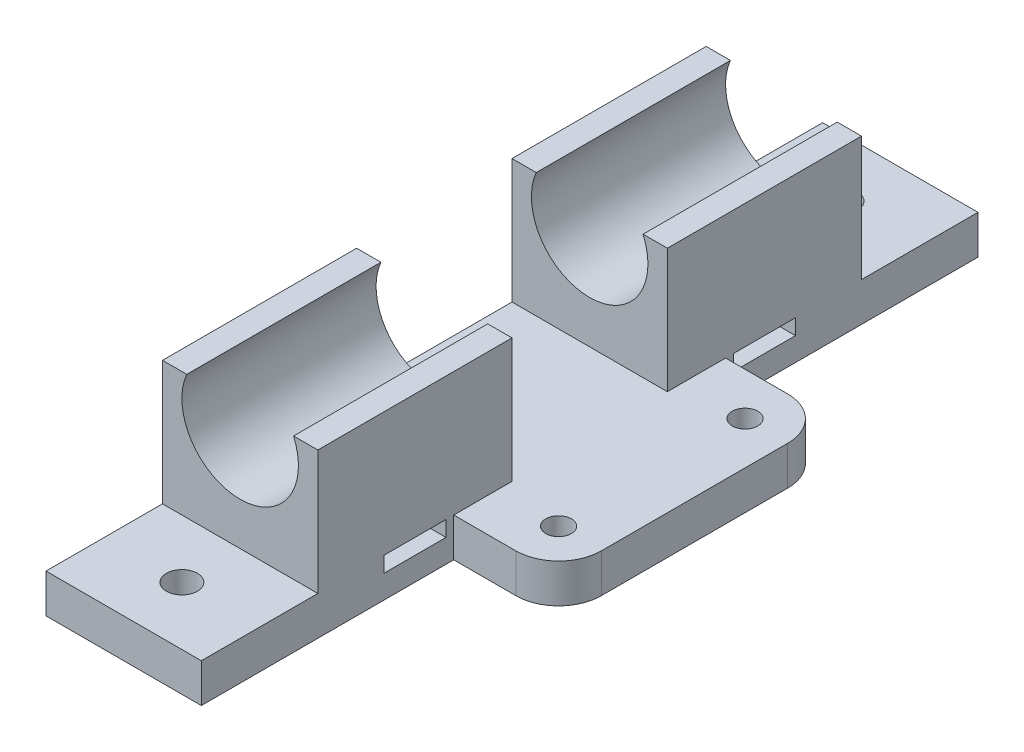
ISO-10303-21;
HEADER;
FILE_DESCRIPTION(('STEP AP214'),'2;1');
FILE_NAME('part.step','',(''),(''),'','','');
FILE_SCHEMA(('AUTOMOTIVE_DESIGN { 1 0 10303 214 1 1 1 1 }'));
ENDSEC;
DATA;
#1=APPLICATION_CONTEXT('core data for automotive mechanical design processes');
#2=APPLICATION_PROTOCOL_DEFINITION('international standard','automotive_design',2000,#1);
#3=PRODUCT_CONTEXT('',#1,'mechanical');
#4=PRODUCT('Part','Part','',(#3));
#5=PRODUCT_RELATED_PRODUCT_CATEGORY('part','',(#4));
#6=PRODUCT_DEFINITION_FORMATION('','',#4);
#7=PRODUCT_DEFINITION_CONTEXT('part definition',#1,'design');
#8=PRODUCT_DEFINITION('design','',#6,#7);
#9=PRODUCT_DEFINITION_SHAPE('','',#8);
#10=(LENGTH_UNIT() NAMED_UNIT(*) SI_UNIT(.MILLI.,.METRE.));
#11=(NAMED_UNIT(*) PLANE_ANGLE_UNIT() SI_UNIT($,.RADIAN.));
#12=(NAMED_UNIT(*) SI_UNIT($,.STERADIAN.) SOLID_ANGLE_UNIT());
#13=UNCERTAINTY_MEASURE_WITH_UNIT(LENGTH_MEASURE(1.E-05),#10,'distance_accuracy_value','');
#14=(GEOMETRIC_REPRESENTATION_CONTEXT(3) GLOBAL_UNCERTAINTY_ASSIGNED_CONTEXT((#13)) GLOBAL_UNIT_ASSIGNED_CONTEXT((#10,
#11,#12)) REPRESENTATION_CONTEXT('',''));
#15=CARTESIAN_POINT('',(0.,0.,0.));
#16=DIRECTION('',(0.,0.,1.));
#17=DIRECTION('',(1.,0.,0.));
#18=AXIS2_PLACEMENT_3D('',#15,#16,#17);
#19=CARTESIAN_POINT('',(10.,0.,0.));
#20=DIRECTION('',(1.,0.,0.));
#21=DIRECTION('',(0.,0.,-1.));
#22=AXIS2_PLACEMENT_3D('',#19,#20,#21);
#23=PLANE('',#22);
#24=DIRECTION('',(0.,0.,-1.));
#25=VECTOR('',#24,1.);
#26=CARTESIAN_POINT('',(10.,3.,-18.5));
#27=LINE('',#26,#25);
#28=CARTESIAN_POINT('',(10.,3.,-18.5));
#29=VERTEX_POINT('',#28);
#30=CARTESIAN_POINT('',(10.,3.00000000000001,-26.5));
#31=VERTEX_POINT('',#30);
#32=EDGE_CURVE('E386',#29,#31,#27,.T.);
#33=ORIENTED_EDGE('',*,*,#32,.F.);
#34=DIRECTION('',(0.,-1.,0.));
#35=VECTOR('',#34,1.);
#36=CARTESIAN_POINT('',(10.,5.00000000000001,-18.5));
#37=LINE('',#36,#35);
#38=CARTESIAN_POINT('',(10.,5.00000000000001,-18.5));
#39=VERTEX_POINT('',#38);
#40=EDGE_CURVE('E384',#39,#29,#37,.T.);
#41=ORIENTED_EDGE('',*,*,#40,.F.);
#42=DIRECTION('',(0.,0.,1.));
#43=VECTOR('',#42,1.);
#44=CARTESIAN_POINT('',(10.,5.00000000000001,-18.5));
#45=LINE('',#44,#43);
#46=CARTESIAN_POINT('',(10.,5.00000000000001,-26.5));
#47=VERTEX_POINT('',#46);
#48=EDGE_CURVE('E392',#47,#39,#45,.T.);
#49=ORIENTED_EDGE('',*,*,#48,.F.);
#50=DIRECTION('',(0.,1.,0.));
#51=VECTOR('',#50,1.);
#52=CARTESIAN_POINT('',(10.,5.00000000000001,-26.5));
#53=LINE('',#52,#51);
#54=EDGE_CURVE('E389',#31,#47,#53,.T.);
#55=ORIENTED_EDGE('',*,*,#54,.F.);
#56=EDGE_LOOP('',(#33,#41,#49,#55));
#57=FACE_BOUND('',#56,.T.);
#58=DIRECTION('',(0.,-1.,0.));
#59=VECTOR('',#58,1.);
#60=CARTESIAN_POINT('',(10.,21.,-9.99999999999999));
#61=LINE('',#60,#59);
#62=CARTESIAN_POINT('',(10.,21.,-9.99999999999999));
#63=VERTEX_POINT('',#62);
#64=CARTESIAN_POINT('',(10.,5.,-10.));
#65=VERTEX_POINT('',#64);
#66=EDGE_CURVE('E426',#63,#65,#61,.T.);
#67=ORIENTED_EDGE('',*,*,#66,.T.);
#68=DIRECTION('',(0.,0.,-1.));
#69=VECTOR('',#68,1.);
#70=CARTESIAN_POINT('',(10.,5.,17.5));
#71=LINE('',#70,#69);
#72=CARTESIAN_POINT('',(10.,5.,-17.5));
#73=VERTEX_POINT('',#72);
#74=EDGE_CURVE('E11',#65,#73,#71,.T.);
#75=ORIENTED_EDGE('',*,*,#74,.T.);
#76=DIRECTION('',(0.,-1.,0.));
#77=VECTOR('',#76,1.);
#78=CARTESIAN_POINT('',(10.,5.,-17.5));
#79=LINE('',#78,#77);
#80=CARTESIAN_POINT('',(10.,0.,-17.5));
#81=VERTEX_POINT('',#80);
#82=EDGE_CURVE('E287',#73,#81,#79,.T.);
#83=ORIENTED_EDGE('',*,*,#82,.T.);
#84=DIRECTION('',(0.,0.,-1.));
#85=VECTOR('',#84,1.);
#86=CARTESIAN_POINT('',(10.,0.,35.));
#87=LINE('',#86,#85);
#88=CARTESIAN_POINT('',(10.,0.,-50.));
#89=VERTEX_POINT('',#88);
#90=EDGE_CURVE('E417',#81,#89,#87,.T.);
#91=ORIENTED_EDGE('',*,*,#90,.T.);
#92=DIRECTION('',(0.,1.,0.));
#93=VECTOR('',#92,1.);
#94=CARTESIAN_POINT('',(10.,-25.,-50.));
#95=LINE('',#94,#93);
#96=CARTESIAN_POINT('',(10.,5.00000000000001,-50.));
#97=VERTEX_POINT('',#96);
#98=EDGE_CURVE('E332',#89,#97,#95,.T.);
#99=ORIENTED_EDGE('',*,*,#98,.T.);
#100=DIRECTION('',(0.,0.,-1.));
#101=VECTOR('',#100,1.);
#102=CARTESIAN_POINT('',(10.,5.,-35.));
#103=LINE('',#102,#101);
#104=CARTESIAN_POINT('',(10.,5.,-35.));
#105=VERTEX_POINT('',#104);
#106=EDGE_CURVE('E326',#105,#97,#103,.T.);
#107=ORIENTED_EDGE('',*,*,#106,.F.);
#108=DIRECTION('',(0.,1.,0.));
#109=VECTOR('',#108,1.);
#110=CARTESIAN_POINT('',(10.,21.,-35.));
#111=LINE('',#110,#109);
#112=CARTESIAN_POINT('',(10.,21.,-35.));
#113=VERTEX_POINT('',#112);
#114=EDGE_CURVE('E422',#105,#113,#111,.T.);
#115=ORIENTED_EDGE('',*,*,#114,.T.);
#116=DIRECTION('',(0.,0.,1.));
#117=VECTOR('',#116,1.);
#118=CARTESIAN_POINT('',(10.,21.,-9.99999999999999));
#119=LINE('',#118,#117);
#120=EDGE_CURVE('E424',#113,#63,#119,.T.);
#121=ORIENTED_EDGE('',*,*,#120,.T.);
#122=EDGE_LOOP('',(#67,#75,#83,#91,#99,#107,#115,#121));
#123=FACE_BOUND('',#122,.T.);
#124=ADVANCED_FACE('F33',(#57,#123),#23,.T.);
#125=CARTESIAN_POINT('',(10.,21.,35.));
#126=DIRECTION('',(0.,0.,-1.));
#127=DIRECTION('',(-1.,0.,0.));
#128=AXIS2_PLACEMENT_3D('',#125,#126,#127);
#129=PLANE('',#128);
#130=DIRECTION('',(-1.,0.,0.));
#131=VECTOR('',#130,1.);
#132=CARTESIAN_POINT('',(-10.,5.,35.));
#133=LINE('',#132,#131);
#134=CARTESIAN_POINT('',(10.,5.,35.));
#135=VERTEX_POINT('',#134);
#136=CARTESIAN_POINT('',(-10.,5.,35.));
#137=VERTEX_POINT('',#136);
#138=EDGE_CURVE('E58',#135,#137,#133,.T.);
#139=ORIENTED_EDGE('',*,*,#138,.F.);
#140=DIRECTION('',(0.,-1.,0.));
#141=VECTOR('',#140,1.);
#142=CARTESIAN_POINT('',(10.,21.,35.));
#143=LINE('',#142,#141);
#144=CARTESIAN_POINT('',(10.,21.,35.));
#145=VERTEX_POINT('',#144);
#146=EDGE_CURVE('E415',#145,#135,#143,.T.);
#147=ORIENTED_EDGE('',*,*,#146,.F.);
#148=DIRECTION('',(-1.,0.,0.));
#149=VECTOR('',#148,1.);
#150=CARTESIAN_POINT('',(10.,21.,35.));
#151=LINE('',#150,#149);
#152=CARTESIAN_POINT('',(6.87386354243376,21.,35.));
#153=VERTEX_POINT('',#152);
#154=EDGE_CURVE('E451',#145,#153,#151,.T.);
#155=ORIENTED_EDGE('',*,*,#154,.T.);
#156=CARTESIAN_POINT('',(0.,18.,35.));
#157=DIRECTION('',(0.,0.,1.));
#158=DIRECTION('',(1.,0.,0.));
#159=AXIS2_PLACEMENT_3D('',#156,#157,#158);
#160=CIRCLE('',#159,7.5);
#161=CARTESIAN_POINT('',(-6.87386354243376,21.,35.));
#162=VERTEX_POINT('',#161);
#163=EDGE_CURVE('E337',#162,#153,#160,.T.);
#164=ORIENTED_EDGE('',*,*,#163,.F.);
#165=CARTESIAN_POINT('',(-10.,21.,35.));
#166=VERTEX_POINT('',#165);
#167=EDGE_CURVE('E433',#162,#166,#151,.T.);
#168=ORIENTED_EDGE('',*,*,#167,.T.);
#169=DIRECTION('',(0.,-1.,0.));
#170=VECTOR('',#169,1.);
#171=CARTESIAN_POINT('',(-10.,21.,35.));
#172=LINE('',#171,#170);
#173=EDGE_CURVE('E414',#166,#137,#172,.T.);
#174=ORIENTED_EDGE('',*,*,#173,.T.);
#175=EDGE_LOOP('',(#139,#147,#155,#164,#168,#174));
#176=FACE_BOUND('',#175,.T.);
#177=ADVANCED_FACE('F35',(#176),#129,.F.);
#178=CARTESIAN_POINT('',(10.,21.,-35.));
#179=DIRECTION('',(0.,0.,1.));
#180=DIRECTION('',(1.,0.,0.));
#181=AXIS2_PLACEMENT_3D('',#178,#179,#180);
#182=PLANE('',#181);
#183=DIRECTION('',(1.,0.,0.));
#184=VECTOR('',#183,1.);
#185=CARTESIAN_POINT('',(-10.,5.,-35.));
#186=LINE('',#185,#184);
#187=CARTESIAN_POINT('',(-10.,5.,-35.));
#188=VERTEX_POINT('',#187);
#189=EDGE_CURVE('E323',#188,#105,#186,.T.);
#190=ORIENTED_EDGE('',*,*,#189,.F.);
#191=DIRECTION('',(0.,1.,0.));
#192=VECTOR('',#191,1.);
#193=CARTESIAN_POINT('',(-10.,21.,-35.));
#194=LINE('',#193,#192);
#195=CARTESIAN_POINT('',(-10.,21.,-35.));
#196=VERTEX_POINT('',#195);
#197=EDGE_CURVE('E437',#188,#196,#194,.T.);
#198=ORIENTED_EDGE('',*,*,#197,.T.);
#199=DIRECTION('',(-1.,0.,0.));
#200=VECTOR('',#199,1.);
#201=CARTESIAN_POINT('',(10.,21.,-35.));
#202=LINE('',#201,#200);
#203=CARTESIAN_POINT('',(-6.87386354243376,21.,-35.));
#204=VERTEX_POINT('',#203);
#205=EDGE_CURVE('E468',#204,#196,#202,.T.);
#206=ORIENTED_EDGE('',*,*,#205,.F.);
#207=CARTESIAN_POINT('',(0.,18.,-35.));
#208=DIRECTION('',(0.,0.,1.));
#209=DIRECTION('',(1.,0.,0.));
#210=AXIS2_PLACEMENT_3D('',#207,#208,#209);
#211=CIRCLE('',#210,7.5);
#212=CARTESIAN_POINT('',(6.87386354243376,21.,-35.));
#213=VERTEX_POINT('',#212);
#214=EDGE_CURVE('E338',#213,#204,#211,.F.);
#215=ORIENTED_EDGE('',*,*,#214,.F.);
#216=EDGE_CURVE('E469',#113,#213,#202,.T.);
#217=ORIENTED_EDGE('',*,*,#216,.F.);
#218=ORIENTED_EDGE('',*,*,#114,.F.);
#219=EDGE_LOOP('',(#190,#198,#206,#215,#217,#218));
#220=FACE_BOUND('',#219,.T.);
#221=ADVANCED_FACE('F522',(#220),#182,.F.);
#222=CARTESIAN_POINT('',(10.,21.,-9.99999999999999));
#223=DIRECTION('',(0.,-1.,0.));
#224=DIRECTION('',(0.,0.,-1.));
#225=AXIS2_PLACEMENT_3D('',#222,#223,#224);
#226=PLANE('',#225);
#227=ORIENTED_EDGE('',*,*,#216,.T.);
#228=DIRECTION('',(0.,0.,1.));
#229=VECTOR('',#228,1.);
#230=CARTESIAN_POINT('',(6.87386354243376,21.,-53.3098334236005));
#231=LINE('',#230,#229);
#232=CARTESIAN_POINT('',(6.87386354243376,21.,-9.99999999999999));
#233=VERTEX_POINT('',#232);
#234=EDGE_CURVE('E343',#213,#233,#231,.T.);
#235=ORIENTED_EDGE('',*,*,#234,.T.);
#236=DIRECTION('',(-1.,0.,0.));
#237=VECTOR('',#236,1.);
#238=CARTESIAN_POINT('',(10.,21.,-9.99999999999999));
#239=LINE('',#238,#237);
#240=EDGE_CURVE('E465',#63,#233,#239,.T.);
#241=ORIENTED_EDGE('',*,*,#240,.F.);
#242=ORIENTED_EDGE('',*,*,#120,.F.);
#243=EDGE_LOOP('',(#227,#235,#241,#242));
#244=FACE_BOUND('',#243,.T.);
#245=ADVANCED_FACE('F541',(#244),#226,.F.);
#246=CARTESIAN_POINT('',(10.,21.,35.));
#247=DIRECTION('',(0.,-1.,0.));
#248=DIRECTION('',(0.,0.,-1.));
#249=AXIS2_PLACEMENT_3D('',#246,#247,#248);
#250=PLANE('',#249);
#251=DIRECTION('',(-1.,0.,0.));
#252=VECTOR('',#251,1.);
#253=CARTESIAN_POINT('',(10.,21.,9.99999999999999));
#254=LINE('',#253,#252);
#255=CARTESIAN_POINT('',(10.,21.,9.99999999999999));
#256=VERTEX_POINT('',#255);
#257=CARTESIAN_POINT('',(6.87386354243376,21.,9.99999999999999));
#258=VERTEX_POINT('',#257);
#259=EDGE_CURVE('E455',#256,#258,#254,.T.);
#260=ORIENTED_EDGE('',*,*,#259,.T.);
#261=DIRECTION('',(0.,0.,1.));
#262=VECTOR('',#261,1.);
#263=CARTESIAN_POINT('',(6.87386354243376,21.,-53.3098334236005));
#264=LINE('',#263,#262);
#265=EDGE_CURVE('E37',#258,#153,#264,.T.);
#266=ORIENTED_EDGE('',*,*,#265,.T.);
#267=ORIENTED_EDGE('',*,*,#154,.F.);
#268=DIRECTION('',(0.,0.,1.));
#269=VECTOR('',#268,1.);
#270=CARTESIAN_POINT('',(10.,21.,35.));
#271=LINE('',#270,#269);
#272=EDGE_CURVE('E431',#256,#145,#271,.T.);
#273=ORIENTED_EDGE('',*,*,#272,.F.);
#274=EDGE_LOOP('',(#260,#266,#267,#273));
#275=FACE_BOUND('',#274,.T.);
#276=ADVANCED_FACE('F479',(#275),#250,.F.);
#277=DIRECTION('',(0.,-1.,0.));
#278=VECTOR('',#277,1.);
#279=CARTESIAN_POINT('',(10.,5.,17.5));
#280=LINE('',#279,#278);
#281=CARTESIAN_POINT('',(10.,5.,17.5));
#282=VERTEX_POINT('',#281);
#283=CARTESIAN_POINT('',(10.,0.,17.5));
#284=VERTEX_POINT('',#283);
#285=EDGE_CURVE('E244',#282,#284,#280,.T.);
#286=ORIENTED_EDGE('',*,*,#285,.F.);
#287=CARTESIAN_POINT('',(10.,5.,10.));
#288=VERTEX_POINT('',#287);
#289=EDGE_CURVE('E43',#282,#288,#71,.T.);
#290=ORIENTED_EDGE('',*,*,#289,.T.);
#291=DIRECTION('',(0.,1.,0.));
#292=VECTOR('',#291,1.);
#293=CARTESIAN_POINT('',(10.,21.,9.99999999999999));
#294=LINE('',#293,#292);
#295=EDGE_CURVE('E429',#288,#256,#294,.T.);
#296=ORIENTED_EDGE('',*,*,#295,.T.);
#297=ORIENTED_EDGE('',*,*,#272,.T.);
#298=ORIENTED_EDGE('',*,*,#146,.T.);
#299=DIRECTION('',(0.,0.,-1.));
#300=VECTOR('',#299,1.);
#301=CARTESIAN_POINT('',(10.,5.,35.));
#302=LINE('',#301,#300);
#303=CARTESIAN_POINT('',(10.,4.99999999999999,50.));
#304=VERTEX_POINT('',#303);
#305=EDGE_CURVE('E304',#304,#135,#302,.T.);
#306=ORIENTED_EDGE('',*,*,#305,.F.);
#307=DIRECTION('',(0.,1.,0.));
#308=VECTOR('',#307,1.);
#309=CARTESIAN_POINT('',(10.,-25.,50.));
#310=LINE('',#309,#308);
#311=CARTESIAN_POINT('',(10.,0.,50.));
#312=VERTEX_POINT('',#311);
#313=EDGE_CURVE('E294',#312,#304,#310,.T.);
#314=ORIENTED_EDGE('',*,*,#313,.F.);
#315=EDGE_CURVE('E419',#312,#284,#87,.T.);
#316=ORIENTED_EDGE('',*,*,#315,.T.);
#317=EDGE_LOOP('',(#286,#290,#296,#297,#298,#306,#314,#316));
#318=FACE_BOUND('',#317,.T.);
#319=DIRECTION('',(0.,0.,-1.));
#320=VECTOR('',#319,1.);
#321=CARTESIAN_POINT('',(10.,3.,18.5));
#322=LINE('',#321,#320);
#323=CARTESIAN_POINT('',(10.,3.,26.5));
#324=VERTEX_POINT('',#323);
#325=CARTESIAN_POINT('',(10.,3.,18.5));
#326=VERTEX_POINT('',#325);
#327=EDGE_CURVE('E355',#324,#326,#322,.T.);
#328=ORIENTED_EDGE('',*,*,#327,.F.);
#329=DIRECTION('',(0.,-1.,0.));
#330=VECTOR('',#329,1.);
#331=CARTESIAN_POINT('',(10.,5.,26.5));
#332=LINE('',#331,#330);
#333=CARTESIAN_POINT('',(10.,5.,26.5));
#334=VERTEX_POINT('',#333);
#335=EDGE_CURVE('E353',#334,#324,#332,.T.);
#336=ORIENTED_EDGE('',*,*,#335,.F.);
#337=DIRECTION('',(0.,0.,1.));
#338=VECTOR('',#337,1.);
#339=CARTESIAN_POINT('',(10.,5.,18.5));
#340=LINE('',#339,#338);
#341=CARTESIAN_POINT('',(10.,5.,18.5));
#342=VERTEX_POINT('',#341);
#343=EDGE_CURVE('E361',#342,#334,#340,.T.);
#344=ORIENTED_EDGE('',*,*,#343,.F.);
#345=DIRECTION('',(0.,1.,0.));
#346=VECTOR('',#345,1.);
#347=CARTESIAN_POINT('',(10.,5.,18.5));
#348=LINE('',#347,#346);
#349=EDGE_CURVE('E358',#326,#342,#348,.T.);
#350=ORIENTED_EDGE('',*,*,#349,.F.);
#351=EDGE_LOOP('',(#328,#336,#344,#350));
#352=FACE_BOUND('',#351,.T.);
#353=ADVANCED_FACE('F486',(#318,#352),#23,.T.);
#354=CARTESIAN_POINT('',(-10.,0.,0.));
#355=DIRECTION('',(1.,0.,0.));
#356=DIRECTION('',(0.,0.,-1.));
#357=AXIS2_PLACEMENT_3D('',#354,#355,#356);
#358=PLANE('',#357);
#359=DIRECTION('',(0.,-1.,0.));
#360=VECTOR('',#359,1.);
#361=CARTESIAN_POINT('',(-10.,5.00000000000001,-18.5));
#362=LINE('',#361,#360);
#363=CARTESIAN_POINT('',(-10.,5.00000000000001,-18.5));
#364=VERTEX_POINT('',#363);
#365=CARTESIAN_POINT('',(-10.,3.,-18.5));
#366=VERTEX_POINT('',#365);
#367=EDGE_CURVE('E383',#364,#366,#362,.T.);
#368=ORIENTED_EDGE('',*,*,#367,.T.);
#369=DIRECTION('',(0.,0.,-1.));
#370=VECTOR('',#369,1.);
#371=CARTESIAN_POINT('',(-10.,3.,-18.5));
#372=LINE('',#371,#370);
#373=CARTESIAN_POINT('',(-10.,3.00000000000001,-26.5));
#374=VERTEX_POINT('',#373);
#375=EDGE_CURVE('E397',#366,#374,#372,.T.);
#376=ORIENTED_EDGE('',*,*,#375,.T.);
#377=DIRECTION('',(0.,1.,0.));
#378=VECTOR('',#377,1.);
#379=CARTESIAN_POINT('',(-10.,5.00000000000001,-26.5));
#380=LINE('',#379,#378);
#381=CARTESIAN_POINT('',(-10.,5.00000000000001,-26.5));
#382=VERTEX_POINT('',#381);
#383=EDGE_CURVE('E400',#374,#382,#380,.T.);
#384=ORIENTED_EDGE('',*,*,#383,.T.);
#385=DIRECTION('',(0.,0.,1.));
#386=VECTOR('',#385,1.);
#387=CARTESIAN_POINT('',(-10.,5.00000000000001,-18.5));
#388=LINE('',#387,#386);
#389=EDGE_CURVE('E387',#382,#364,#388,.T.);
#390=ORIENTED_EDGE('',*,*,#389,.T.);
#391=EDGE_LOOP('',(#368,#376,#384,#390));
#392=FACE_BOUND('',#391,.T.);
#393=ORIENTED_EDGE('',*,*,#173,.F.);
#394=DIRECTION('',(0.,0.,1.));
#395=VECTOR('',#394,1.);
#396=CARTESIAN_POINT('',(-10.,21.,35.));
#397=LINE('',#396,#395);
#398=CARTESIAN_POINT('',(-10.,21.,9.99999999999999));
#399=VERTEX_POINT('',#398);
#400=EDGE_CURVE('E418',#399,#166,#397,.T.);
#401=ORIENTED_EDGE('',*,*,#400,.F.);
#402=DIRECTION('',(0.,1.,0.));
#403=VECTOR('',#402,1.);
#404=CARTESIAN_POINT('',(-10.,21.,9.99999999999999));
#405=LINE('',#404,#403);
#406=CARTESIAN_POINT('',(-10.,5.,10.));
#407=VERTEX_POINT('',#406);
#408=EDGE_CURVE('E446',#407,#399,#405,.T.);
#409=ORIENTED_EDGE('',*,*,#408,.F.);
#410=DIRECTION('',(0.,0.,1.));
#411=VECTOR('',#410,1.);
#412=CARTESIAN_POINT('',(-10.,5.,10.));
#413=LINE('',#412,#411);
#414=CARTESIAN_POINT('',(-10.,5.,-10.));
#415=VERTEX_POINT('',#414);
#416=EDGE_CURVE('E444',#415,#407,#413,.T.);
#417=ORIENTED_EDGE('',*,*,#416,.F.);
#418=DIRECTION('',(0.,-1.,0.));
#419=VECTOR('',#418,1.);
#420=CARTESIAN_POINT('',(-10.,21.,-9.99999999999999));
#421=LINE('',#420,#419);
#422=CARTESIAN_POINT('',(-10.,21.,-9.99999999999999));
#423=VERTEX_POINT('',#422);
#424=EDGE_CURVE('E442',#423,#415,#421,.T.);
#425=ORIENTED_EDGE('',*,*,#424,.F.);
#426=DIRECTION('',(0.,0.,1.));
#427=VECTOR('',#426,1.);
#428=CARTESIAN_POINT('',(-10.,21.,-9.99999999999999));
#429=LINE('',#428,#427);
#430=EDGE_CURVE('E439',#196,#423,#429,.T.);
#431=ORIENTED_EDGE('',*,*,#430,.F.);
#432=ORIENTED_EDGE('',*,*,#197,.F.);
#433=DIRECTION('',(0.,0.,1.));
#434=VECTOR('',#433,1.);
#435=CARTESIAN_POINT('',(-10.,5.,-35.));
#436=LINE('',#435,#434);
#437=CARTESIAN_POINT('',(-10.,5.00000000000001,-50.));
#438=VERTEX_POINT('',#437);
#439=EDGE_CURVE('E320',#438,#188,#436,.T.);
#440=ORIENTED_EDGE('',*,*,#439,.F.);
#441=DIRECTION('',(0.,1.,0.));
#442=VECTOR('',#441,1.);
#443=CARTESIAN_POINT('',(-10.,-25.,-50.));
#444=LINE('',#443,#442);
#445=CARTESIAN_POINT('',(-10.,0.,-50.));
#446=VERTEX_POINT('',#445);
#447=EDGE_CURVE('E317',#446,#438,#444,.T.);
#448=ORIENTED_EDGE('',*,*,#447,.F.);
#449=DIRECTION('',(0.,0.,-1.));
#450=VECTOR('',#449,1.);
#451=CARTESIAN_POINT('',(-10.,0.,35.));
#452=LINE('',#451,#450);
#453=CARTESIAN_POINT('',(-10.,0.,50.));
#454=VERTEX_POINT('',#453);
#455=EDGE_CURVE('E435',#454,#446,#452,.T.);
#456=ORIENTED_EDGE('',*,*,#455,.F.);
#457=DIRECTION('',(0.,1.,0.));
#458=VECTOR('',#457,1.);
#459=CARTESIAN_POINT('',(-10.,-25.,50.));
#460=LINE('',#459,#458);
#461=CARTESIAN_POINT('',(-10.,4.99999999999999,50.));
#462=VERTEX_POINT('',#461);
#463=EDGE_CURVE('E307',#454,#462,#460,.T.);
#464=ORIENTED_EDGE('',*,*,#463,.T.);
#465=DIRECTION('',(0.,0.,1.));
#466=VECTOR('',#465,1.);
#467=CARTESIAN_POINT('',(-10.,5.,35.));
#468=LINE('',#467,#466);
#469=EDGE_CURVE('E298',#137,#462,#468,.T.);
#470=ORIENTED_EDGE('',*,*,#469,.F.);
#471=EDGE_LOOP('',(#393,#401,#409,#417,#425,#431,#432,#440,#448,#456,#464,#470));
#472=FACE_BOUND('',#471,.T.);
#473=DIRECTION('',(0.,-1.,0.));
#474=VECTOR('',#473,1.);
#475=CARTESIAN_POINT('',(-10.,5.,26.5));
#476=LINE('',#475,#474);
#477=CARTESIAN_POINT('',(-10.,5.,26.5));
#478=VERTEX_POINT('',#477);
#479=CARTESIAN_POINT('',(-10.,3.,26.5));
#480=VERTEX_POINT('',#479);
#481=EDGE_CURVE('E352',#478,#480,#476,.T.);
#482=ORIENTED_EDGE('',*,*,#481,.T.);
#483=DIRECTION('',(0.,0.,-1.));
#484=VECTOR('',#483,1.);
#485=CARTESIAN_POINT('',(-10.,3.,18.5));
#486=LINE('',#485,#484);
#487=CARTESIAN_POINT('',(-10.,3.,18.5));
#488=VERTEX_POINT('',#487);
#489=EDGE_CURVE('E366',#480,#488,#486,.T.);
#490=ORIENTED_EDGE('',*,*,#489,.T.);
#491=DIRECTION('',(0.,1.,0.));
#492=VECTOR('',#491,1.);
#493=CARTESIAN_POINT('',(-10.,5.,18.5));
#494=LINE('',#493,#492);
#495=CARTESIAN_POINT('',(-10.,5.,18.5));
#496=VERTEX_POINT('',#495);
#497=EDGE_CURVE('E369',#488,#496,#494,.T.);
#498=ORIENTED_EDGE('',*,*,#497,.T.);
#499=DIRECTION('',(0.,0.,1.));
#500=VECTOR('',#499,1.);
#501=CARTESIAN_POINT('',(-10.,5.,18.5));
#502=LINE('',#501,#500);
#503=EDGE_CURVE('E356',#496,#478,#502,.T.);
#504=ORIENTED_EDGE('',*,*,#503,.T.);
#505=EDGE_LOOP('',(#482,#490,#498,#504));
#506=FACE_BOUND('',#505,.T.);
#507=ADVANCED_FACE('F529',(#392,#472,#506),#358,.F.);
#508=CARTESIAN_POINT('',(10.,0.,35.));
#509=DIRECTION('',(0.,1.,0.));
#510=DIRECTION('',(0.,0.,1.));
#511=AXIS2_PLACEMENT_3D('',#508,#509,#510);
#512=PLANE('',#511);
#513=ORIENTED_EDGE('',*,*,#455,.T.);
#514=DIRECTION('',(1.,0.,0.));
#515=VECTOR('',#514,1.);
#516=CARTESIAN_POINT('',(-10.,0.,-50.));
#517=LINE('',#516,#515);
#518=EDGE_CURVE('E313',#446,#89,#517,.T.);
#519=ORIENTED_EDGE('',*,*,#518,.T.);
#520=ORIENTED_EDGE('',*,*,#90,.F.);
#521=DIRECTION('',(1.,0.,0.));
#522=VECTOR('',#521,1.);
#523=CARTESIAN_POINT('',(10.,0.,-17.5));
#524=LINE('',#523,#522);
#525=CARTESIAN_POINT('',(18.,0.,-17.5));
#526=VERTEX_POINT('',#525);
#527=EDGE_CURVE('E50',#81,#526,#524,.T.);
#528=ORIENTED_EDGE('',*,*,#527,.T.);
#529=CARTESIAN_POINT('',(18.,0.,-12.));
#530=DIRECTION('',(0.,-1.,0.));
#531=DIRECTION('',(0.,0.,-1.));
#532=AXIS2_PLACEMENT_3D('',#529,#530,#531);
#533=CIRCLE('',#532,5.5);
#534=CARTESIAN_POINT('',(23.5,0.,-12.));
#535=VERTEX_POINT('',#534);
#536=EDGE_CURVE('E261',#526,#535,#533,.T.);
#537=ORIENTED_EDGE('',*,*,#536,.T.);
#538=DIRECTION('',(0.,0.,1.));
#539=VECTOR('',#538,1.);
#540=CARTESIAN_POINT('',(23.5,0.,12.));
#541=LINE('',#540,#539);
#542=CARTESIAN_POINT('',(23.5,0.,12.));
#543=VERTEX_POINT('',#542);
#544=EDGE_CURVE('E258',#535,#543,#541,.T.);
#545=ORIENTED_EDGE('',*,*,#544,.T.);
#546=CARTESIAN_POINT('',(18.,0.,12.));
#547=DIRECTION('',(0.,-1.,0.));
#548=DIRECTION('',(0.,0.,-1.));
#549=AXIS2_PLACEMENT_3D('',#546,#547,#548);
#550=CIRCLE('',#549,5.5);
#551=CARTESIAN_POINT('',(18.,0.,17.5));
#552=VERTEX_POINT('',#551);
#553=EDGE_CURVE('E274',#543,#552,#550,.T.);
#554=ORIENTED_EDGE('',*,*,#553,.T.);
#555=DIRECTION('',(-1.,0.,0.));
#556=VECTOR('',#555,1.);
#557=CARTESIAN_POINT('',(18.,0.,17.5));
#558=LINE('',#557,#556);
#559=EDGE_CURVE('E239',#552,#284,#558,.T.);
#560=ORIENTED_EDGE('',*,*,#559,.T.);
#561=ORIENTED_EDGE('',*,*,#315,.F.);
#562=DIRECTION('',(-1.,0.,0.));
#563=VECTOR('',#562,1.);
#564=CARTESIAN_POINT('',(-10.,0.,50.));
#565=LINE('',#564,#563);
#566=EDGE_CURVE('E290',#312,#454,#565,.T.);
#567=ORIENTED_EDGE('',*,*,#566,.T.);
#568=EDGE_LOOP('',(#513,#519,#520,#528,#537,#545,#554,#560,#561,#567));
#569=FACE_BOUND('',#568,.T.);
#570=CARTESIAN_POINT('',(0.,0.,-42.5));
#571=DIRECTION('',(0.,1.,0.));
#572=DIRECTION('',(0.,0.,1.));
#573=AXIS2_PLACEMENT_3D('',#570,#571,#572);
#574=CIRCLE('',#573,2.);
#575=CARTESIAN_POINT('',(0.,0.,-40.5));
#576=VERTEX_POINT('',#575);
#577=EDGE_CURVE('E316',#576,#576,#574,.F.);
#578=ORIENTED_EDGE('',*,*,#577,.F.);
#579=EDGE_LOOP('',(#578));
#580=FACE_BOUND('',#579,.T.);
#581=CARTESIAN_POINT('',(0.,0.,42.5));
#582=DIRECTION('',(0.,1.,0.));
#583=DIRECTION('',(0.,0.,1.));
#584=AXIS2_PLACEMENT_3D('',#581,#582,#583);
#585=CIRCLE('',#584,2.);
#586=CARTESIAN_POINT('',(0.,0.,44.5));
#587=VERTEX_POINT('',#586);
#588=EDGE_CURVE('E293',#587,#587,#585,.F.);
#589=ORIENTED_EDGE('',*,*,#588,.F.);
#590=EDGE_LOOP('',(#589));
#591=FACE_BOUND('',#590,.T.);
#592=CARTESIAN_POINT('',(18.,0.,-12.));
#593=DIRECTION('',(0.,-1.,0.));
#594=DIRECTION('',(0.,0.,-1.));
#595=AXIS2_PLACEMENT_3D('',#592,#593,#594);
#596=CIRCLE('',#595,1.65);
#597=CARTESIAN_POINT('',(18.,0.,-13.65));
#598=VERTEX_POINT('',#597);
#599=EDGE_CURVE('E923',#598,#598,#596,.T.);
#600=ORIENTED_EDGE('',*,*,#599,.F.);
#601=EDGE_LOOP('',(#600));
#602=FACE_BOUND('',#601,.T.);
#603=CARTESIAN_POINT('',(18.,0.,12.));
#604=DIRECTION('',(0.,-1.,0.));
#605=DIRECTION('',(0.,0.,-1.));
#606=AXIS2_PLACEMENT_3D('',#603,#604,#605);
#607=CIRCLE('',#606,1.65);
#608=CARTESIAN_POINT('',(18.,0.,10.35));
#609=VERTEX_POINT('',#608);
#610=EDGE_CURVE('E264',#609,#609,#607,.T.);
#611=ORIENTED_EDGE('',*,*,#610,.F.);
#612=EDGE_LOOP('',(#611));
#613=FACE_BOUND('',#612,.T.);
#614=ADVANCED_FACE('F498',(#569,#580,#591,#602,#613),#512,.F.);
#615=CARTESIAN_POINT('',(-6.87386354243376,21.,-9.99999999999999));
#616=VERTEX_POINT('',#615);
#617=EDGE_CURVE('E464',#616,#423,#239,.T.);
#618=ORIENTED_EDGE('',*,*,#617,.F.);
#619=DIRECTION('',(0.,0.,1.));
#620=VECTOR('',#619,1.);
#621=CARTESIAN_POINT('',(-6.87386354243376,21.,-53.3098334236005));
#622=LINE('',#621,#620);
#623=EDGE_CURVE('E341',#204,#616,#622,.T.);
#624=ORIENTED_EDGE('',*,*,#623,.F.);
#625=ORIENTED_EDGE('',*,*,#205,.T.);
#626=ORIENTED_EDGE('',*,*,#430,.T.);
#627=EDGE_LOOP('',(#618,#624,#625,#626));
#628=FACE_BOUND('',#627,.T.);
#629=ADVANCED_FACE('F535',(#628),#226,.F.);
#630=CARTESIAN_POINT('',(10.,21.,-9.99999999999999));
#631=DIRECTION('',(0.,0.,-1.));
#632=DIRECTION('',(0.,1.,0.));
#633=AXIS2_PLACEMENT_3D('',#630,#631,#632);
#634=PLANE('',#633);
#635=ORIENTED_EDGE('',*,*,#240,.T.);
#636=CARTESIAN_POINT('',(0.,18.,-9.99999999999999));
#637=DIRECTION('',(0.,0.,-1.));
#638=DIRECTION('',(0.,1.,0.));
#639=AXIS2_PLACEMENT_3D('',#636,#637,#638);
#640=CIRCLE('',#639,7.5);
#641=EDGE_CURVE('E349',#233,#616,#640,.T.);
#642=ORIENTED_EDGE('',*,*,#641,.T.);
#643=ORIENTED_EDGE('',*,*,#617,.T.);
#644=ORIENTED_EDGE('',*,*,#424,.T.);
#645=DIRECTION('',(-1.,0.,0.));
#646=VECTOR('',#645,1.);
#647=CARTESIAN_POINT('',(10.,5.,-10.));
#648=LINE('',#647,#646);
#649=EDGE_CURVE('E461',#65,#415,#648,.T.);
#650=ORIENTED_EDGE('',*,*,#649,.F.);
#651=ORIENTED_EDGE('',*,*,#66,.F.);
#652=EDGE_LOOP('',(#635,#642,#643,#644,#650,#651));
#653=FACE_BOUND('',#652,.T.);
#654=ADVANCED_FACE('F546',(#653),#634,.F.);
#655=CARTESIAN_POINT('',(10.,5.,10.));
#656=DIRECTION('',(0.,-1.,0.));
#657=DIRECTION('',(0.,0.,-1.));
#658=AXIS2_PLACEMENT_3D('',#655,#656,#657);
#659=PLANE('',#658);
#660=ORIENTED_EDGE('',*,*,#416,.T.);
#661=DIRECTION('',(-1.,0.,0.));
#662=VECTOR('',#661,1.);
#663=CARTESIAN_POINT('',(10.,5.,10.));
#664=LINE('',#663,#662);
#665=EDGE_CURVE('E458',#288,#407,#664,.T.);
#666=ORIENTED_EDGE('',*,*,#665,.F.);
#667=ORIENTED_EDGE('',*,*,#289,.F.);
#668=DIRECTION('',(-1.,0.,0.));
#669=VECTOR('',#668,1.);
#670=CARTESIAN_POINT('',(18.,5.,17.5));
#671=LINE('',#670,#669);
#672=CARTESIAN_POINT('',(18.,5.,17.5));
#673=VERTEX_POINT('',#672);
#674=EDGE_CURVE('E236',#673,#282,#671,.T.);
#675=ORIENTED_EDGE('',*,*,#674,.F.);
#676=CARTESIAN_POINT('',(18.,5.,12.));
#677=DIRECTION('',(0.,-1.,0.));
#678=DIRECTION('',(0.,0.,-1.));
#679=AXIS2_PLACEMENT_3D('',#676,#677,#678);
#680=CIRCLE('',#679,5.5);
#681=CARTESIAN_POINT('',(23.5,5.,12.));
#682=VERTEX_POINT('',#681);
#683=EDGE_CURVE('E252',#682,#673,#680,.T.);
#684=ORIENTED_EDGE('',*,*,#683,.F.);
#685=DIRECTION('',(0.,0.,1.));
#686=VECTOR('',#685,1.);
#687=CARTESIAN_POINT('',(23.5,5.,12.));
#688=LINE('',#687,#686);
#689=CARTESIAN_POINT('',(23.5,5.,-12.));
#690=VERTEX_POINT('',#689);
#691=EDGE_CURVE('E245',#690,#682,#688,.T.);
#692=ORIENTED_EDGE('',*,*,#691,.F.);
#693=CARTESIAN_POINT('',(18.,5.,-12.));
#694=DIRECTION('',(0.,-1.,0.));
#695=DIRECTION('',(0.,0.,-1.));
#696=AXIS2_PLACEMENT_3D('',#693,#694,#695);
#697=CIRCLE('',#696,5.5);
#698=CARTESIAN_POINT('',(18.,5.,-17.5));
#699=VERTEX_POINT('',#698);
#700=EDGE_CURVE('E270',#699,#690,#697,.T.);
#701=ORIENTED_EDGE('',*,*,#700,.F.);
#702=DIRECTION('',(1.,0.,0.));
#703=VECTOR('',#702,1.);
#704=CARTESIAN_POINT('',(10.,5.,-17.5));
#705=LINE('',#704,#703);
#706=EDGE_CURVE('E267',#73,#699,#705,.T.);
#707=ORIENTED_EDGE('',*,*,#706,.F.);
#708=ORIENTED_EDGE('',*,*,#74,.F.);
#709=ORIENTED_EDGE('',*,*,#649,.T.);
#710=EDGE_LOOP('',(#660,#666,#667,#675,#684,#692,#701,#707,#708,#709));
#711=FACE_BOUND('',#710,.T.);
#712=CARTESIAN_POINT('',(18.,5.,-12.));
#713=DIRECTION('',(0.,-1.,0.));
#714=DIRECTION('',(0.,0.,-1.));
#715=AXIS2_PLACEMENT_3D('',#712,#713,#714);
#716=CIRCLE('',#715,1.65);
#717=CARTESIAN_POINT('',(18.,5.,-13.65));
#718=VERTEX_POINT('',#717);
#719=EDGE_CURVE('E927',#718,#718,#716,.T.);
#720=ORIENTED_EDGE('',*,*,#719,.T.);
#721=EDGE_LOOP('',(#720));
#722=FACE_BOUND('',#721,.T.);
#723=CARTESIAN_POINT('',(18.,5.,12.));
#724=DIRECTION('',(0.,-1.,0.));
#725=DIRECTION('',(0.,0.,-1.));
#726=AXIS2_PLACEMENT_3D('',#723,#724,#725);
#727=CIRCLE('',#726,1.65);
#728=CARTESIAN_POINT('',(18.,5.,10.35));
#729=VERTEX_POINT('',#728);
#730=EDGE_CURVE('E276',#729,#729,#727,.T.);
#731=ORIENTED_EDGE('',*,*,#730,.T.);
#732=EDGE_LOOP('',(#731));
#733=FACE_BOUND('',#732,.T.);
#734=ADVANCED_FACE('F249',(#711,#722,#733),#659,.F.);
#735=CARTESIAN_POINT('',(10.,21.,9.99999999999999));
#736=DIRECTION('',(0.,0.,1.));
#737=DIRECTION('',(0.,-1.,0.));
#738=AXIS2_PLACEMENT_3D('',#735,#736,#737);
#739=PLANE('',#738);
#740=CARTESIAN_POINT('',(-6.87386354243376,21.,9.99999999999999));
#741=VERTEX_POINT('',#740);
#742=EDGE_CURVE('E454',#741,#399,#254,.T.);
#743=ORIENTED_EDGE('',*,*,#742,.F.);
#744=CARTESIAN_POINT('',(0.,18.,9.99999999999999));
#745=DIRECTION('',(0.,0.,1.));
#746=DIRECTION('',(0.,-1.,0.));
#747=AXIS2_PLACEMENT_3D('',#744,#745,#746);
#748=CIRCLE('',#747,7.5);
#749=EDGE_CURVE('E340',#741,#258,#748,.T.);
#750=ORIENTED_EDGE('',*,*,#749,.T.);
#751=ORIENTED_EDGE('',*,*,#259,.F.);
#752=ORIENTED_EDGE('',*,*,#295,.F.);
#753=ORIENTED_EDGE('',*,*,#665,.T.);
#754=ORIENTED_EDGE('',*,*,#408,.T.);
#755=EDGE_LOOP('',(#743,#750,#751,#752,#753,#754));
#756=FACE_BOUND('',#755,.T.);
#757=ADVANCED_FACE('F550',(#756),#739,.F.);
#758=ORIENTED_EDGE('',*,*,#167,.F.);
#759=DIRECTION('',(0.,0.,1.));
#760=VECTOR('',#759,1.);
#761=CARTESIAN_POINT('',(-6.87386354243376,21.,-53.3098334236005));
#762=LINE('',#761,#760);
#763=EDGE_CURVE('E471',#162,#741,#762,.F.);
#764=ORIENTED_EDGE('',*,*,#763,.T.);
#765=ORIENTED_EDGE('',*,*,#742,.T.);
#766=ORIENTED_EDGE('',*,*,#400,.T.);
#767=EDGE_LOOP('',(#758,#764,#765,#766));
#768=FACE_BOUND('',#767,.T.);
#769=ADVANCED_FACE('F583',(#768),#250,.F.);
#770=CARTESIAN_POINT('',(10.,5.00000000000001,-18.5));
#771=DIRECTION('',(0.,0.,-1.));
#772=DIRECTION('',(-1.,0.,0.));
#773=AXIS2_PLACEMENT_3D('',#770,#771,#772);
#774=PLANE('',#773);
#775=ORIENTED_EDGE('',*,*,#367,.F.);
#776=DIRECTION('',(-1.,0.,0.));
#777=VECTOR('',#776,1.);
#778=CARTESIAN_POINT('',(10.,5.00000000000001,-18.5));
#779=LINE('',#778,#777);
#780=EDGE_CURVE('E394',#39,#364,#779,.T.);
#781=ORIENTED_EDGE('',*,*,#780,.F.);
#782=ORIENTED_EDGE('',*,*,#40,.T.);
#783=DIRECTION('',(-1.,0.,0.));
#784=VECTOR('',#783,1.);
#785=CARTESIAN_POINT('',(10.,3.,-18.5));
#786=LINE('',#785,#784);
#787=EDGE_CURVE('E411',#29,#366,#786,.T.);
#788=ORIENTED_EDGE('',*,*,#787,.T.);
#789=EDGE_LOOP('',(#775,#781,#782,#788));
#790=FACE_BOUND('',#789,.T.);
#791=ADVANCED_FACE('F590',(#790),#774,.T.);
#792=CARTESIAN_POINT('',(10.,3.,-18.5));
#793=DIRECTION('',(0.,1.,0.));
#794=DIRECTION('',(0.,0.,1.));
#795=AXIS2_PLACEMENT_3D('',#792,#793,#794);
#796=PLANE('',#795);
#797=ORIENTED_EDGE('',*,*,#375,.F.);
#798=ORIENTED_EDGE('',*,*,#787,.F.);
#799=ORIENTED_EDGE('',*,*,#32,.T.);
#800=DIRECTION('',(-1.,0.,0.));
#801=VECTOR('',#800,1.);
#802=CARTESIAN_POINT('',(10.,3.00000000000001,-26.5));
#803=LINE('',#802,#801);
#804=EDGE_CURVE('E409',#31,#374,#803,.T.);
#805=ORIENTED_EDGE('',*,*,#804,.T.);
#806=EDGE_LOOP('',(#797,#798,#799,#805));
#807=FACE_BOUND('',#806,.T.);
#808=ADVANCED_FACE('F595',(#807),#796,.T.);
#809=CARTESIAN_POINT('',(10.,5.00000000000001,-26.5));
#810=DIRECTION('',(0.,0.,1.));
#811=DIRECTION('',(1.,0.,0.));
#812=AXIS2_PLACEMENT_3D('',#809,#810,#811);
#813=PLANE('',#812);
#814=ORIENTED_EDGE('',*,*,#383,.F.);
#815=ORIENTED_EDGE('',*,*,#804,.F.);
#816=ORIENTED_EDGE('',*,*,#54,.T.);
#817=DIRECTION('',(-1.,0.,0.));
#818=VECTOR('',#817,1.);
#819=CARTESIAN_POINT('',(10.,5.00000000000001,-26.5));
#820=LINE('',#819,#818);
#821=EDGE_CURVE('E407',#47,#382,#820,.T.);
#822=ORIENTED_EDGE('',*,*,#821,.T.);
#823=EDGE_LOOP('',(#814,#815,#816,#822));
#824=FACE_BOUND('',#823,.T.);
#825=ADVANCED_FACE('F839',(#824),#813,.T.);
#826=CARTESIAN_POINT('',(10.,5.00000000000001,-18.5));
#827=DIRECTION('',(0.,-1.,0.));
#828=DIRECTION('',(0.,0.,-1.));
#829=AXIS2_PLACEMENT_3D('',#826,#827,#828);
#830=PLANE('',#829);
#831=ORIENTED_EDGE('',*,*,#389,.F.);
#832=ORIENTED_EDGE('',*,*,#821,.F.);
#833=ORIENTED_EDGE('',*,*,#48,.T.);
#834=ORIENTED_EDGE('',*,*,#780,.T.);
#835=EDGE_LOOP('',(#831,#832,#833,#834));
#836=FACE_BOUND('',#835,.T.);
#837=ADVANCED_FACE('F829',(#836),#830,.T.);
#838=CARTESIAN_POINT('',(10.,5.,26.5));
#839=DIRECTION('',(0.,0.,-1.));
#840=DIRECTION('',(-1.,0.,0.));
#841=AXIS2_PLACEMENT_3D('',#838,#839,#840);
#842=PLANE('',#841);
#843=ORIENTED_EDGE('',*,*,#481,.F.);
#844=DIRECTION('',(-1.,0.,0.));
#845=VECTOR('',#844,1.);
#846=CARTESIAN_POINT('',(10.,5.,26.5));
#847=LINE('',#846,#845);
#848=EDGE_CURVE('E363',#334,#478,#847,.T.);
#849=ORIENTED_EDGE('',*,*,#848,.F.);
#850=ORIENTED_EDGE('',*,*,#335,.T.);
#851=DIRECTION('',(-1.,0.,0.));
#852=VECTOR('',#851,1.);
#853=CARTESIAN_POINT('',(10.,3.,26.5));
#854=LINE('',#853,#852);
#855=EDGE_CURVE('E380',#324,#480,#854,.T.);
#856=ORIENTED_EDGE('',*,*,#855,.T.);
#857=EDGE_LOOP('',(#843,#849,#850,#856));
#858=FACE_BOUND('',#857,.T.);
#859=ADVANCED_FACE('F819',(#858),#842,.T.);
#860=CARTESIAN_POINT('',(10.,3.,18.5));
#861=DIRECTION('',(0.,1.,0.));
#862=DIRECTION('',(0.,0.,1.));
#863=AXIS2_PLACEMENT_3D('',#860,#861,#862);
#864=PLANE('',#863);
#865=ORIENTED_EDGE('',*,*,#489,.F.);
#866=ORIENTED_EDGE('',*,*,#855,.F.);
#867=ORIENTED_EDGE('',*,*,#327,.T.);
#868=DIRECTION('',(-1.,0.,0.));
#869=VECTOR('',#868,1.);
#870=CARTESIAN_POINT('',(10.,3.,18.5));
#871=LINE('',#870,#869);
#872=EDGE_CURVE('E378',#326,#488,#871,.T.);
#873=ORIENTED_EDGE('',*,*,#872,.T.);
#874=EDGE_LOOP('',(#865,#866,#867,#873));
#875=FACE_BOUND('',#874,.T.);
#876=ADVANCED_FACE('F809',(#875),#864,.T.);
#877=CARTESIAN_POINT('',(10.,5.,18.5));
#878=DIRECTION('',(0.,0.,1.));
#879=DIRECTION('',(1.,0.,0.));
#880=AXIS2_PLACEMENT_3D('',#877,#878,#879);
#881=PLANE('',#880);
#882=ORIENTED_EDGE('',*,*,#497,.F.);
#883=ORIENTED_EDGE('',*,*,#872,.F.);
#884=ORIENTED_EDGE('',*,*,#349,.T.);
#885=DIRECTION('',(-1.,0.,0.));
#886=VECTOR('',#885,1.);
#887=CARTESIAN_POINT('',(10.,5.,18.5));
#888=LINE('',#887,#886);
#889=EDGE_CURVE('E376',#342,#496,#888,.T.);
#890=ORIENTED_EDGE('',*,*,#889,.T.);
#891=EDGE_LOOP('',(#882,#883,#884,#890));
#892=FACE_BOUND('',#891,.T.);
#893=ADVANCED_FACE('F561',(#892),#881,.T.);
#894=CARTESIAN_POINT('',(10.,5.,18.5));
#895=DIRECTION('',(0.,-1.,0.));
#896=DIRECTION('',(0.,0.,-1.));
#897=AXIS2_PLACEMENT_3D('',#894,#895,#896);
#898=PLANE('',#897);
#899=ORIENTED_EDGE('',*,*,#503,.F.);
#900=ORIENTED_EDGE('',*,*,#889,.F.);
#901=ORIENTED_EDGE('',*,*,#343,.T.);
#902=ORIENTED_EDGE('',*,*,#848,.T.);
#903=EDGE_LOOP('',(#899,#900,#901,#902));
#904=FACE_BOUND('',#903,.T.);
#905=ADVANCED_FACE('F555',(#904),#898,.T.);
#906=CARTESIAN_POINT('',(0.,18.,-53.3098334236005));
#907=DIRECTION('',(0.,0.,1.));
#908=DIRECTION('',(1.,0.,0.));
#909=AXIS2_PLACEMENT_3D('',#906,#907,#908);
#910=CYLINDRICAL_SURFACE('',#909,7.5);
#911=ORIENTED_EDGE('',*,*,#763,.F.);
#912=ORIENTED_EDGE('',*,*,#163,.T.);
#913=ORIENTED_EDGE('',*,*,#265,.F.);
#914=ORIENTED_EDGE('',*,*,#749,.F.);
#915=EDGE_LOOP('',(#911,#912,#913,#914));
#916=FACE_BOUND('',#915,.T.);
#917=ADVANCED_FACE('F552',(#916),#910,.F.);
#918=ORIENTED_EDGE('',*,*,#234,.F.);
#919=ORIENTED_EDGE('',*,*,#214,.T.);
#920=ORIENTED_EDGE('',*,*,#623,.T.);
#921=ORIENTED_EDGE('',*,*,#641,.F.);
#922=EDGE_LOOP('',(#918,#919,#920,#921));
#923=FACE_BOUND('',#922,.T.);
#924=ADVANCED_FACE('F554',(#923),#910,.F.);
#925=CARTESIAN_POINT('',(-10.,-25.,-50.));
#926=DIRECTION('',(0.,0.,-1.));
#927=DIRECTION('',(0.,1.,0.));
#928=AXIS2_PLACEMENT_3D('',#925,#926,#927);
#929=PLANE('',#928);
#930=ORIENTED_EDGE('',*,*,#518,.F.);
#931=ORIENTED_EDGE('',*,*,#447,.T.);
#932=DIRECTION('',(-1.,0.,0.));
#933=VECTOR('',#932,1.);
#934=CARTESIAN_POINT('',(-10.,5.00000000000001,-50.));
#935=LINE('',#934,#933);
#936=EDGE_CURVE('E329',#97,#438,#935,.T.);
#937=ORIENTED_EDGE('',*,*,#936,.F.);
#938=ORIENTED_EDGE('',*,*,#98,.F.);
#939=EDGE_LOOP('',(#930,#931,#937,#938));
#940=FACE_BOUND('',#939,.T.);
#941=ADVANCED_FACE('F515',(#940),#929,.T.);
#942=CARTESIAN_POINT('',(0.,5.,0.));
#943=DIRECTION('',(0.,-1.,0.));
#944=DIRECTION('',(0.,0.,-1.));
#945=AXIS2_PLACEMENT_3D('',#942,#943,#944);
#946=PLANE('',#945);
#947=CARTESIAN_POINT('',(0.,5.00000000000001,-42.5));
#948=DIRECTION('',(0.,1.,0.));
#949=DIRECTION('',(0.,0.,1.));
#950=AXIS2_PLACEMENT_3D('',#947,#948,#949);
#951=CIRCLE('',#950,2.);
#952=CARTESIAN_POINT('',(0.,5.00000000000001,-40.5));
#953=VERTEX_POINT('',#952);
#954=EDGE_CURVE('E312',#953,#953,#951,.T.);
#955=ORIENTED_EDGE('',*,*,#954,.F.);
#956=EDGE_LOOP('',(#955));
#957=FACE_BOUND('',#956,.T.);
#958=ORIENTED_EDGE('',*,*,#439,.T.);
#959=ORIENTED_EDGE('',*,*,#189,.T.);
#960=ORIENTED_EDGE('',*,*,#106,.T.);
#961=ORIENTED_EDGE('',*,*,#936,.T.);
#962=EDGE_LOOP('',(#958,#959,#960,#961));
#963=FACE_BOUND('',#962,.T.);
#964=ADVANCED_FACE('F518',(#957,#963),#946,.F.);
#965=CARTESIAN_POINT('',(0.,-25.,-42.5));
#966=DIRECTION('',(0.,1.,0.));
#967=DIRECTION('',(0.,0.,1.));
#968=AXIS2_PLACEMENT_3D('',#965,#966,#967);
#969=CYLINDRICAL_SURFACE('',#968,2.);
#970=ORIENTED_EDGE('',*,*,#577,.T.);
#971=EDGE_LOOP('',(#970));
#972=FACE_BOUND('',#971,.T.);
#973=ORIENTED_EDGE('',*,*,#954,.T.);
#974=EDGE_LOOP('',(#973));
#975=FACE_BOUND('',#974,.T.);
#976=ADVANCED_FACE('F721',(#972,#975),#969,.F.);
#977=CARTESIAN_POINT('',(-10.,-25.,50.));
#978=DIRECTION('',(0.,0.,1.));
#979=DIRECTION('',(0.,-1.,0.));
#980=AXIS2_PLACEMENT_3D('',#977,#978,#979);
#981=PLANE('',#980);
#982=ORIENTED_EDGE('',*,*,#566,.F.);
#983=ORIENTED_EDGE('',*,*,#313,.T.);
#984=DIRECTION('',(1.,0.,0.));
#985=VECTOR('',#984,1.);
#986=CARTESIAN_POINT('',(-10.,4.99999999999999,50.));
#987=LINE('',#986,#985);
#988=EDGE_CURVE('E301',#462,#304,#987,.T.);
#989=ORIENTED_EDGE('',*,*,#988,.F.);
#990=ORIENTED_EDGE('',*,*,#463,.F.);
#991=EDGE_LOOP('',(#982,#983,#989,#990));
#992=FACE_BOUND('',#991,.T.);
#993=ADVANCED_FACE('F496',(#992),#981,.T.);
#994=CARTESIAN_POINT('',(0.,5.,0.));
#995=DIRECTION('',(0.,-1.,0.));
#996=DIRECTION('',(0.,0.,-1.));
#997=AXIS2_PLACEMENT_3D('',#994,#995,#996);
#998=PLANE('',#997);
#999=CARTESIAN_POINT('',(0.,4.99999999999999,42.5));
#1000=DIRECTION('',(0.,1.,0.));
#1001=DIRECTION('',(0.,0.,-1.));
#1002=AXIS2_PLACEMENT_3D('',#999,#1000,#1001);
#1003=CIRCLE('',#1002,2.);
#1004=CARTESIAN_POINT('',(0.,4.99999999999999,40.5));
#1005=VERTEX_POINT('',#1004);
#1006=EDGE_CURVE('E282',#1005,#1005,#1003,.T.);
#1007=ORIENTED_EDGE('',*,*,#1006,.F.);
#1008=EDGE_LOOP('',(#1007));
#1009=FACE_BOUND('',#1008,.T.);
#1010=ORIENTED_EDGE('',*,*,#138,.T.);
#1011=ORIENTED_EDGE('',*,*,#469,.T.);
#1012=ORIENTED_EDGE('',*,*,#988,.T.);
#1013=ORIENTED_EDGE('',*,*,#305,.T.);
#1014=EDGE_LOOP('',(#1010,#1011,#1012,#1013));
#1015=FACE_BOUND('',#1014,.T.);
#1016=ADVANCED_FACE('F490',(#1009,#1015),#998,.F.);
#1017=CARTESIAN_POINT('',(0.,-25.,42.5));
#1018=DIRECTION('',(0.,1.,0.));
#1019=DIRECTION('',(0.,0.,1.));
#1020=AXIS2_PLACEMENT_3D('',#1017,#1018,#1019);
#1021=CYLINDRICAL_SURFACE('',#1020,2.);
#1022=ORIENTED_EDGE('',*,*,#588,.T.);
#1023=EDGE_LOOP('',(#1022));
#1024=FACE_BOUND('',#1023,.T.);
#1025=ORIENTED_EDGE('',*,*,#1006,.T.);
#1026=EDGE_LOOP('',(#1025));
#1027=FACE_BOUND('',#1026,.T.);
#1028=ADVANCED_FACE('F622',(#1024,#1027),#1021,.F.);
#1029=CARTESIAN_POINT('',(18.,5.,12.));
#1030=DIRECTION('',(0.,-1.,0.));
#1031=DIRECTION('',(0.,0.,-1.));
#1032=AXIS2_PLACEMENT_3D('',#1029,#1030,#1031);
#1033=CYLINDRICAL_SURFACE('',#1032,5.5);
#1034=ORIENTED_EDGE('',*,*,#553,.F.);
#1035=DIRECTION('',(0.,-1.,0.));
#1036=VECTOR('',#1035,1.);
#1037=CARTESIAN_POINT('',(23.5,5.,12.));
#1038=LINE('',#1037,#1036);
#1039=EDGE_CURVE('E257',#682,#543,#1038,.T.);
#1040=ORIENTED_EDGE('',*,*,#1039,.F.);
#1041=ORIENTED_EDGE('',*,*,#683,.T.);
#1042=DIRECTION('',(0.,-1.,0.));
#1043=VECTOR('',#1042,1.);
#1044=CARTESIAN_POINT('',(18.,5.,17.5));
#1045=LINE('',#1044,#1043);
#1046=EDGE_CURVE('E233',#673,#552,#1045,.T.);
#1047=ORIENTED_EDGE('',*,*,#1046,.T.);
#1048=EDGE_LOOP('',(#1034,#1040,#1041,#1047));
#1049=FACE_BOUND('',#1048,.T.);
#1050=ADVANCED_FACE('F256',(#1049),#1033,.T.);
#1051=CARTESIAN_POINT('',(23.5,5.,12.));
#1052=DIRECTION('',(1.,0.,0.));
#1053=DIRECTION('',(0.,0.,-1.));
#1054=AXIS2_PLACEMENT_3D('',#1051,#1052,#1053);
#1055=PLANE('',#1054);
#1056=ORIENTED_EDGE('',*,*,#544,.F.);
#1057=DIRECTION('',(0.,-1.,0.));
#1058=VECTOR('',#1057,1.);
#1059=CARTESIAN_POINT('',(23.5,5.,-12.));
#1060=LINE('',#1059,#1058);
#1061=EDGE_CURVE('E283',#690,#535,#1060,.T.);
#1062=ORIENTED_EDGE('',*,*,#1061,.F.);
#1063=ORIENTED_EDGE('',*,*,#691,.T.);
#1064=ORIENTED_EDGE('',*,*,#1039,.T.);
#1065=EDGE_LOOP('',(#1056,#1062,#1063,#1064));
#1066=FACE_BOUND('',#1065,.T.);
#1067=ADVANCED_FACE('F503',(#1066),#1055,.T.);
#1068=CARTESIAN_POINT('',(18.,5.,-12.));
#1069=DIRECTION('',(0.,-1.,0.));
#1070=DIRECTION('',(0.,0.,-1.));
#1071=AXIS2_PLACEMENT_3D('',#1068,#1069,#1070);
#1072=CYLINDRICAL_SURFACE('',#1071,5.5);
#1073=ORIENTED_EDGE('',*,*,#536,.F.);
#1074=DIRECTION('',(0.,-1.,0.));
#1075=VECTOR('',#1074,1.);
#1076=CARTESIAN_POINT('',(18.,5.,-17.5));
#1077=LINE('',#1076,#1075);
#1078=EDGE_CURVE('E285',#699,#526,#1077,.T.);
#1079=ORIENTED_EDGE('',*,*,#1078,.F.);
#1080=ORIENTED_EDGE('',*,*,#700,.T.);
#1081=ORIENTED_EDGE('',*,*,#1061,.T.);
#1082=EDGE_LOOP('',(#1073,#1079,#1080,#1081));
#1083=FACE_BOUND('',#1082,.T.);
#1084=ADVANCED_FACE('F629',(#1083),#1072,.T.);
#1085=CARTESIAN_POINT('',(10.,5.,-17.5));
#1086=DIRECTION('',(0.,0.,-1.));
#1087=DIRECTION('',(-1.,0.,0.));
#1088=AXIS2_PLACEMENT_3D('',#1085,#1086,#1087);
#1089=PLANE('',#1088);
#1090=ORIENTED_EDGE('',*,*,#527,.F.);
#1091=ORIENTED_EDGE('',*,*,#82,.F.);
#1092=ORIENTED_EDGE('',*,*,#706,.T.);
#1093=ORIENTED_EDGE('',*,*,#1078,.T.);
#1094=EDGE_LOOP('',(#1090,#1091,#1092,#1093));
#1095=FACE_BOUND('',#1094,.T.);
#1096=ADVANCED_FACE('F507',(#1095),#1089,.T.);
#1097=CARTESIAN_POINT('',(18.,5.,17.5));
#1098=DIRECTION('',(0.,0.,1.));
#1099=DIRECTION('',(1.,0.,0.));
#1100=AXIS2_PLACEMENT_3D('',#1097,#1098,#1099);
#1101=PLANE('',#1100);
#1102=ORIENTED_EDGE('',*,*,#559,.F.);
#1103=ORIENTED_EDGE('',*,*,#1046,.F.);
#1104=ORIENTED_EDGE('',*,*,#674,.T.);
#1105=ORIENTED_EDGE('',*,*,#285,.T.);
#1106=EDGE_LOOP('',(#1102,#1103,#1104,#1105));
#1107=FACE_BOUND('',#1106,.T.);
#1108=ADVANCED_FACE('F235',(#1107),#1101,.T.);
#1109=CARTESIAN_POINT('',(18.,5.,12.));
#1110=DIRECTION('',(0.,-1.,0.));
#1111=DIRECTION('',(0.,0.,-1.));
#1112=AXIS2_PLACEMENT_3D('',#1109,#1110,#1111);
#1113=CYLINDRICAL_SURFACE('',#1112,1.65);
#1114=ORIENTED_EDGE('',*,*,#730,.F.);
#1115=EDGE_LOOP('',(#1114));
#1116=FACE_BOUND('',#1115,.T.);
#1117=ORIENTED_EDGE('',*,*,#610,.T.);
#1118=EDGE_LOOP('',(#1117));
#1119=FACE_BOUND('',#1118,.T.);
#1120=ADVANCED_FACE('F648',(#1116,#1119),#1113,.F.);
#1121=CARTESIAN_POINT('',(18.,5.,-12.));
#1122=DIRECTION('',(0.,-1.,0.));
#1123=DIRECTION('',(0.,0.,-1.));
#1124=AXIS2_PLACEMENT_3D('',#1121,#1122,#1123);
#1125=CYLINDRICAL_SURFACE('',#1124,1.65);
#1126=ORIENTED_EDGE('',*,*,#719,.F.);
#1127=EDGE_LOOP('',(#1126));
#1128=FACE_BOUND('',#1127,.T.);
#1129=ORIENTED_EDGE('',*,*,#599,.T.);
#1130=EDGE_LOOP('',(#1129));
#1131=FACE_BOUND('',#1130,.T.);
#1132=ADVANCED_FACE('F655',(#1128,#1131),#1125,.F.);
#1133=CLOSED_SHELL('',(#124,#177,#221,#245,#276,#353,#507,#614,#629,#654,#734,#757,#769,#791,
#808,#825,#837,#859,#876,#893,#905,#917,#924,#941,#964,#976,#993,#1016,#1028,#1050,#1067,#1084,
#1096,#1108,#1120,#1132));
#1134=MANIFOLD_SOLID_BREP('B2',#1133);
#1135=ADVANCED_BREP_SHAPE_REPRESENTATION('',(#18,#1134),#14);
#1136=SHAPE_DEFINITION_REPRESENTATION(#9,#1135);
ENDSEC;
END-ISO-10303-21;
